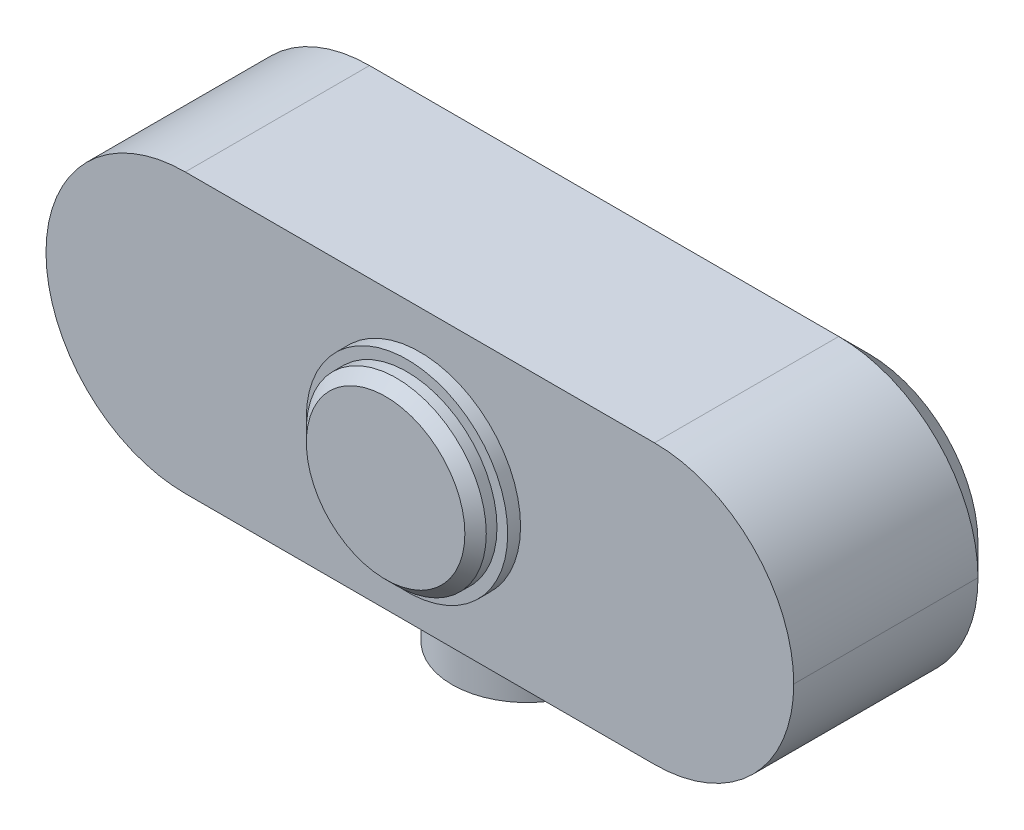
ISO-10303-21;
HEADER;
FILE_DESCRIPTION(('STEP AP214'),'2;1');
FILE_NAME('part.step','',(''),(''),'','','');
FILE_SCHEMA(('AUTOMOTIVE_DESIGN { 1 0 10303 214 1 1 1 1 }'));
ENDSEC;
DATA;
#1=APPLICATION_CONTEXT('core data for automotive mechanical design processes');
#2=APPLICATION_PROTOCOL_DEFINITION('international standard','automotive_design',2000,#1);
#3=PRODUCT_CONTEXT('',#1,'mechanical');
#4=PRODUCT('Part','Part','',(#3));
#5=PRODUCT_RELATED_PRODUCT_CATEGORY('part','',(#4));
#6=PRODUCT_DEFINITION_FORMATION('','',#4);
#7=PRODUCT_DEFINITION_CONTEXT('part definition',#1,'design');
#8=PRODUCT_DEFINITION('design','',#6,#7);
#9=PRODUCT_DEFINITION_SHAPE('','',#8);
#10=(LENGTH_UNIT() NAMED_UNIT(*) SI_UNIT(.MILLI.,.METRE.));
#11=(NAMED_UNIT(*) PLANE_ANGLE_UNIT() SI_UNIT($,.RADIAN.));
#12=(NAMED_UNIT(*) SI_UNIT($,.STERADIAN.) SOLID_ANGLE_UNIT());
#13=UNCERTAINTY_MEASURE_WITH_UNIT(LENGTH_MEASURE(1.E-05),#10,'distance_accuracy_value','');
#14=(GEOMETRIC_REPRESENTATION_CONTEXT(3) GLOBAL_UNCERTAINTY_ASSIGNED_CONTEXT((#13)) GLOBAL_UNIT_ASSIGNED_CONTEXT((#10,
#11,#12)) REPRESENTATION_CONTEXT('',''));
#15=CARTESIAN_POINT('',(0.,0.,0.));
#16=DIRECTION('',(0.,0.,1.));
#17=DIRECTION('',(1.,0.,0.));
#18=AXIS2_PLACEMENT_3D('',#15,#16,#17);
#19=CARTESIAN_POINT('',(34.9,-13.,20.));
#20=DIRECTION('',(0.,1.,0.));
#21=DIRECTION('',(-1.,0.,0.));
#22=AXIS2_PLACEMENT_3D('',#19,#20,#21);
#23=PLANE('',#22);
#24=CARTESIAN_POINT('',(0.,-13.,10.));
#25=DIRECTION('',(0.,1.,0.));
#26=DIRECTION('',(-1.,0.,0.));
#27=AXIS2_PLACEMENT_3D('',#24,#25,#26);
#28=CIRCLE('',#27,7.);
#29=CARTESIAN_POINT('',(-6.99999999999999,-13.,10.));
#30=VERTEX_POINT('',#29);
#31=EDGE_CURVE('E237',#30,#30,#28,.F.);
#32=ORIENTED_EDGE('',*,*,#31,.F.);
#33=EDGE_LOOP('',(#32));
#34=FACE_BOUND('',#33,.T.);
#35=DIRECTION('',(0.,0.,-1.));
#36=VECTOR('',#35,1.);
#37=CARTESIAN_POINT('',(-21.9,-13.,20.));
#38=LINE('',#37,#36);
#39=CARTESIAN_POINT('',(-21.9,-13.,20.));
#40=VERTEX_POINT('',#39);
#41=CARTESIAN_POINT('',(-21.9,-13.,2.79999999999996));
#42=VERTEX_POINT('',#41);
#43=EDGE_CURVE('E213',#40,#42,#38,.T.);
#44=ORIENTED_EDGE('',*,*,#43,.T.);
#45=DIRECTION('',(1.,0.,0.));
#46=VECTOR('',#45,1.);
#47=CARTESIAN_POINT('',(34.9,-13.,2.79999999999996));
#48=LINE('',#47,#46);
#49=CARTESIAN_POINT('',(21.9,-13.,2.79999999999996));
#50=VERTEX_POINT('',#49);
#51=EDGE_CURVE('E260',#42,#50,#48,.T.);
#52=ORIENTED_EDGE('',*,*,#51,.T.);
#53=DIRECTION('',(0.,0.,-1.));
#54=VECTOR('',#53,1.);
#55=CARTESIAN_POINT('',(21.9,-13.,20.));
#56=LINE('',#55,#54);
#57=CARTESIAN_POINT('',(21.9,-13.,20.));
#58=VERTEX_POINT('',#57);
#59=EDGE_CURVE('E211',#50,#58,#56,.F.);
#60=ORIENTED_EDGE('',*,*,#59,.T.);
#61=DIRECTION('',(1.,0.,0.));
#62=VECTOR('',#61,1.);
#63=CARTESIAN_POINT('',(34.9,-13.,20.));
#64=LINE('',#63,#62);
#65=EDGE_CURVE('E204',#40,#58,#64,.T.);
#66=ORIENTED_EDGE('',*,*,#65,.F.);
#67=EDGE_LOOP('',(#44,#52,#60,#66));
#68=FACE_BOUND('',#67,.T.);
#69=ADVANCED_FACE('F40',(#34,#68),#23,.F.);
#70=CARTESIAN_POINT('',(34.9,13.,20.));
#71=DIRECTION('',(0.,-1.,0.));
#72=DIRECTION('',(1.,0.,0.));
#73=AXIS2_PLACEMENT_3D('',#70,#71,#72);
#74=PLANE('',#73);
#75=DIRECTION('',(0.,0.,-1.));
#76=VECTOR('',#75,1.);
#77=CARTESIAN_POINT('',(21.9,13.,20.));
#78=LINE('',#77,#76);
#79=CARTESIAN_POINT('',(21.9,13.,20.));
#80=VERTEX_POINT('',#79);
#81=CARTESIAN_POINT('',(21.9,13.,2.79999999999996));
#82=VERTEX_POINT('',#81);
#83=EDGE_CURVE('E225',#80,#82,#78,.T.);
#84=ORIENTED_EDGE('',*,*,#83,.T.);
#85=DIRECTION('',(-1.,0.,0.));
#86=VECTOR('',#85,1.);
#87=CARTESIAN_POINT('',(34.9,13.,2.79999999999996));
#88=LINE('',#87,#86);
#89=CARTESIAN_POINT('',(-21.9,13.,2.79999999999996));
#90=VERTEX_POINT('',#89);
#91=EDGE_CURVE('E262',#82,#90,#88,.T.);
#92=ORIENTED_EDGE('',*,*,#91,.T.);
#93=DIRECTION('',(0.,0.,-1.));
#94=VECTOR('',#93,1.);
#95=CARTESIAN_POINT('',(-21.9,13.,20.));
#96=LINE('',#95,#94);
#97=CARTESIAN_POINT('',(-21.9,13.,20.));
#98=VERTEX_POINT('',#97);
#99=EDGE_CURVE('E197',#90,#98,#96,.F.);
#100=ORIENTED_EDGE('',*,*,#99,.T.);
#101=DIRECTION('',(-1.,0.,0.));
#102=VECTOR('',#101,1.);
#103=CARTESIAN_POINT('',(34.9,13.,20.));
#104=LINE('',#103,#102);
#105=EDGE_CURVE('E207',#80,#98,#104,.T.);
#106=ORIENTED_EDGE('',*,*,#105,.F.);
#107=EDGE_LOOP('',(#84,#92,#100,#106));
#108=FACE_BOUND('',#107,.T.);
#109=ADVANCED_FACE('F294',(#108),#74,.F.);
#110=CARTESIAN_POINT('',(0.,0.,20.));
#111=DIRECTION('',(0.,0.,1.));
#112=DIRECTION('',(1.,0.,0.));
#113=AXIS2_PLACEMENT_3D('',#110,#111,#112);
#114=PLANE('',#113);
#115=CARTESIAN_POINT('',(0.,0.,20.));
#116=DIRECTION('',(0.,0.,1.));
#117=DIRECTION('',(1.,0.,0.));
#118=AXIS2_PLACEMENT_3D('',#115,#116,#117);
#119=CIRCLE('',#118,9.4);
#120=CARTESIAN_POINT('',(9.4,0.,20.));
#121=VERTEX_POINT('',#120);
#122=EDGE_CURVE('E192',#121,#121,#119,.T.);
#123=ORIENTED_EDGE('',*,*,#122,.F.);
#124=EDGE_LOOP('',(#123));
#125=FACE_BOUND('',#124,.T.);
#126=CARTESIAN_POINT('',(-21.9,0.,20.));
#127=DIRECTION('',(0.,0.,1.));
#128=DIRECTION('',(1.,0.,0.));
#129=AXIS2_PLACEMENT_3D('',#126,#127,#128);
#130=CIRCLE('',#129,13.);
#131=CARTESIAN_POINT('',(-34.9,0.,20.));
#132=VERTEX_POINT('',#131);
#133=EDGE_CURVE('E221',#98,#132,#130,.T.);
#134=ORIENTED_EDGE('',*,*,#133,.T.);
#135=CARTESIAN_POINT('',(-21.9,0.,20.));
#136=DIRECTION('',(0.,0.,1.));
#137=DIRECTION('',(1.,0.,0.));
#138=AXIS2_PLACEMENT_3D('',#135,#136,#137);
#139=CIRCLE('',#138,13.);
#140=EDGE_CURVE('E223',#132,#40,#139,.T.);
#141=ORIENTED_EDGE('',*,*,#140,.T.);
#142=ORIENTED_EDGE('',*,*,#65,.T.);
#143=CARTESIAN_POINT('',(21.9,0.,20.));
#144=DIRECTION('',(0.,0.,1.));
#145=DIRECTION('',(1.,0.,0.));
#146=AXIS2_PLACEMENT_3D('',#143,#144,#145);
#147=CIRCLE('',#146,13.);
#148=CARTESIAN_POINT('',(34.9,0.,20.));
#149=VERTEX_POINT('',#148);
#150=EDGE_CURVE('E218',#58,#149,#147,.T.);
#151=ORIENTED_EDGE('',*,*,#150,.T.);
#152=CARTESIAN_POINT('',(21.9,0.,20.));
#153=DIRECTION('',(0.,0.,1.));
#154=DIRECTION('',(1.,0.,0.));
#155=AXIS2_PLACEMENT_3D('',#152,#153,#154);
#156=CIRCLE('',#155,13.);
#157=EDGE_CURVE('E216',#149,#80,#156,.T.);
#158=ORIENTED_EDGE('',*,*,#157,.T.);
#159=ORIENTED_EDGE('',*,*,#105,.T.);
#160=EDGE_LOOP('',(#134,#141,#142,#151,#158,#159));
#161=FACE_BOUND('',#160,.T.);
#162=ADVANCED_FACE('F298',(#125,#161),#114,.T.);
#163=CARTESIAN_POINT('',(0.,0.,0.));
#164=DIRECTION('',(0.,0.,1.));
#165=DIRECTION('',(1.,0.,0.));
#166=AXIS2_PLACEMENT_3D('',#163,#164,#165);
#167=PLANE('',#166);
#168=DIRECTION('',(-1.,0.,0.));
#169=VECTOR('',#168,1.);
#170=CARTESIAN_POINT('',(0.,-10.2,0.));
#171=LINE('',#170,#169);
#172=CARTESIAN_POINT('',(21.9,-10.2,0.));
#173=VERTEX_POINT('',#172);
#174=CARTESIAN_POINT('',(21.4,-10.2,0.));
#175=VERTEX_POINT('',#174);
#176=EDGE_CURVE('E247',#173,#175,#171,.T.);
#177=ORIENTED_EDGE('',*,*,#176,.T.);
#178=DIRECTION('',(0.,-1.,0.));
#179=VECTOR('',#178,1.);
#180=CARTESIAN_POINT('',(21.4,-10.2,0.));
#181=LINE('',#180,#179);
#182=CARTESIAN_POINT('',(21.4,-8.,0.));
#183=VERTEX_POINT('',#182);
#184=EDGE_CURVE('E58',#183,#175,#181,.T.);
#185=ORIENTED_EDGE('',*,*,#184,.F.);
#186=CARTESIAN_POINT('',(18.9,-8.,0.));
#187=DIRECTION('',(0.,0.,-1.));
#188=DIRECTION('',(1.,0.,0.));
#189=AXIS2_PLACEMENT_3D('',#186,#187,#188);
#190=CIRCLE('',#189,2.5);
#191=CARTESIAN_POINT('',(16.4,-8.,0.));
#192=VERTEX_POINT('',#191);
#193=EDGE_CURVE('E162',#192,#183,#190,.T.);
#194=ORIENTED_EDGE('',*,*,#193,.F.);
#195=DIRECTION('',(0.,1.,0.));
#196=VECTOR('',#195,1.);
#197=CARTESIAN_POINT('',(16.4,-8.,0.));
#198=LINE('',#197,#196);
#199=CARTESIAN_POINT('',(16.4,-10.2,0.));
#200=VERTEX_POINT('',#199);
#201=EDGE_CURVE('E170',#200,#192,#198,.T.);
#202=ORIENTED_EDGE('',*,*,#201,.F.);
#203=CARTESIAN_POINT('',(-21.9,-10.2,0.));
#204=VERTEX_POINT('',#203);
#205=EDGE_CURVE('E246',#200,#204,#171,.T.);
#206=ORIENTED_EDGE('',*,*,#205,.T.);
#207=CARTESIAN_POINT('',(-21.9,0.,0.));
#208=DIRECTION('',(0.,0.,1.));
#209=DIRECTION('',(1.,0.,0.));
#210=AXIS2_PLACEMENT_3D('',#207,#208,#209);
#211=CIRCLE('',#210,10.2);
#212=CARTESIAN_POINT('',(-32.1,0.,0.));
#213=VERTEX_POINT('',#212);
#214=EDGE_CURVE('E252',#204,#213,#211,.F.);
#215=ORIENTED_EDGE('',*,*,#214,.T.);
#216=CARTESIAN_POINT('',(-21.9,0.,0.));
#217=DIRECTION('',(0.,0.,1.));
#218=DIRECTION('',(1.,0.,0.));
#219=AXIS2_PLACEMENT_3D('',#216,#217,#218);
#220=CIRCLE('',#219,10.2);
#221=CARTESIAN_POINT('',(-21.9,10.2,0.));
#222=VERTEX_POINT('',#221);
#223=EDGE_CURVE('E250',#213,#222,#220,.F.);
#224=ORIENTED_EDGE('',*,*,#223,.T.);
#225=DIRECTION('',(1.,0.,0.));
#226=VECTOR('',#225,1.);
#227=CARTESIAN_POINT('',(0.,10.2,0.));
#228=LINE('',#227,#226);
#229=CARTESIAN_POINT('',(21.9,10.2,0.));
#230=VERTEX_POINT('',#229);
#231=EDGE_CURVE('E244',#222,#230,#228,.T.);
#232=ORIENTED_EDGE('',*,*,#231,.T.);
#233=CARTESIAN_POINT('',(21.9,0.,0.));
#234=DIRECTION('',(0.,0.,1.));
#235=DIRECTION('',(1.,0.,0.));
#236=AXIS2_PLACEMENT_3D('',#233,#234,#235);
#237=CIRCLE('',#236,10.2);
#238=CARTESIAN_POINT('',(32.1,0.,0.));
#239=VERTEX_POINT('',#238);
#240=EDGE_CURVE('E240',#230,#239,#237,.F.);
#241=ORIENTED_EDGE('',*,*,#240,.T.);
#242=CARTESIAN_POINT('',(21.9,0.,0.));
#243=DIRECTION('',(0.,0.,1.));
#244=DIRECTION('',(1.,0.,0.));
#245=AXIS2_PLACEMENT_3D('',#242,#243,#244);
#246=CIRCLE('',#245,10.2);
#247=EDGE_CURVE('E242',#239,#173,#246,.F.);
#248=ORIENTED_EDGE('',*,*,#247,.T.);
#249=EDGE_LOOP('',(#177,#185,#194,#202,#206,#215,#224,#232,#241,#248));
#250=FACE_BOUND('',#249,.T.);
#251=ADVANCED_FACE('F375',(#250),#167,.F.);
#252=CARTESIAN_POINT('',(-21.9,0.,20.));
#253=DIRECTION('',(0.,0.,-1.));
#254=DIRECTION('',(-1.,0.,0.));
#255=AXIS2_PLACEMENT_3D('',#252,#253,#254);
#256=CYLINDRICAL_SURFACE('',#255,13.);
#257=ORIENTED_EDGE('',*,*,#99,.F.);
#258=CARTESIAN_POINT('',(-21.9,0.,2.79999999999996));
#259=DIRECTION('',(0.,0.,1.));
#260=DIRECTION('',(1.,0.,0.));
#261=AXIS2_PLACEMENT_3D('',#258,#259,#260);
#262=CIRCLE('',#261,13.);
#263=CARTESIAN_POINT('',(-34.9,0.,2.79999999999996));
#264=VERTEX_POINT('',#263);
#265=EDGE_CURVE('E258',#90,#264,#262,.T.);
#266=ORIENTED_EDGE('',*,*,#265,.T.);
#267=DIRECTION('',(0.,0.,-1.));
#268=VECTOR('',#267,1.);
#269=CARTESIAN_POINT('',(-34.9,0.,20.));
#270=LINE('',#269,#268);
#271=EDGE_CURVE('E208',#132,#264,#270,.T.);
#272=ORIENTED_EDGE('',*,*,#271,.F.);
#273=ORIENTED_EDGE('',*,*,#133,.F.);
#274=EDGE_LOOP('',(#257,#266,#272,#273));
#275=FACE_BOUND('',#274,.T.);
#276=ADVANCED_FACE('F301',(#275),#256,.T.);
#277=CARTESIAN_POINT('',(-21.9,0.,20.));
#278=DIRECTION('',(0.,0.,-1.));
#279=DIRECTION('',(-1.,0.,0.));
#280=AXIS2_PLACEMENT_3D('',#277,#278,#279);
#281=CYLINDRICAL_SURFACE('',#280,13.);
#282=ORIENTED_EDGE('',*,*,#271,.T.);
#283=CARTESIAN_POINT('',(-21.9,0.,2.79999999999996));
#284=DIRECTION('',(0.,0.,1.));
#285=DIRECTION('',(1.,0.,0.));
#286=AXIS2_PLACEMENT_3D('',#283,#284,#285);
#287=CIRCLE('',#286,13.);
#288=EDGE_CURVE('E255',#264,#42,#287,.T.);
#289=ORIENTED_EDGE('',*,*,#288,.T.);
#290=ORIENTED_EDGE('',*,*,#43,.F.);
#291=ORIENTED_EDGE('',*,*,#140,.F.);
#292=EDGE_LOOP('',(#282,#289,#290,#291));
#293=FACE_BOUND('',#292,.T.);
#294=ADVANCED_FACE('F308',(#293),#281,.T.);
#295=CARTESIAN_POINT('',(21.9,0.,20.));
#296=DIRECTION('',(0.,0.,-1.));
#297=DIRECTION('',(-1.,0.,0.));
#298=AXIS2_PLACEMENT_3D('',#295,#296,#297);
#299=CYLINDRICAL_SURFACE('',#298,13.);
#300=DIRECTION('',(0.,0.,-1.));
#301=VECTOR('',#300,1.);
#302=CARTESIAN_POINT('',(34.9,0.,20.));
#303=LINE('',#302,#301);
#304=CARTESIAN_POINT('',(34.9,0.,2.79999999999996));
#305=VERTEX_POINT('',#304);
#306=EDGE_CURVE('E201',#305,#149,#303,.F.);
#307=ORIENTED_EDGE('',*,*,#306,.F.);
#308=CARTESIAN_POINT('',(21.9,0.,2.79999999999996));
#309=DIRECTION('',(0.,0.,1.));
#310=DIRECTION('',(1.,0.,0.));
#311=AXIS2_PLACEMENT_3D('',#308,#309,#310);
#312=CIRCLE('',#311,13.);
#313=EDGE_CURVE('E11',#305,#82,#312,.T.);
#314=ORIENTED_EDGE('',*,*,#313,.T.);
#315=ORIENTED_EDGE('',*,*,#83,.F.);
#316=ORIENTED_EDGE('',*,*,#157,.F.);
#317=EDGE_LOOP('',(#307,#314,#315,#316));
#318=FACE_BOUND('',#317,.T.);
#319=ADVANCED_FACE('F290',(#318),#299,.T.);
#320=CARTESIAN_POINT('',(21.9,0.,20.));
#321=DIRECTION('',(0.,0.,-1.));
#322=DIRECTION('',(-1.,0.,0.));
#323=AXIS2_PLACEMENT_3D('',#320,#321,#322);
#324=CYLINDRICAL_SURFACE('',#323,13.);
#325=ORIENTED_EDGE('',*,*,#59,.F.);
#326=CARTESIAN_POINT('',(21.9,0.,2.79999999999996));
#327=DIRECTION('',(0.,0.,1.));
#328=DIRECTION('',(1.,0.,0.));
#329=AXIS2_PLACEMENT_3D('',#326,#327,#328);
#330=CIRCLE('',#329,13.);
#331=EDGE_CURVE('E50',#50,#305,#330,.T.);
#332=ORIENTED_EDGE('',*,*,#331,.T.);
#333=ORIENTED_EDGE('',*,*,#306,.T.);
#334=ORIENTED_EDGE('',*,*,#150,.F.);
#335=EDGE_LOOP('',(#325,#332,#333,#334));
#336=FACE_BOUND('',#335,.T.);
#337=ADVANCED_FACE('F313',(#336),#324,.T.);
#338=CARTESIAN_POINT('',(0.,0.,21.2));
#339=DIRECTION('',(0.,0.,-1.));
#340=DIRECTION('',(-1.,0.,0.));
#341=AXIS2_PLACEMENT_3D('',#338,#339,#340);
#342=CYLINDRICAL_SURFACE('',#341,9.4);
#343=CARTESIAN_POINT('',(0.,0.,21.2));
#344=DIRECTION('',(0.,0.,1.));
#345=DIRECTION('',(1.,0.,0.));
#346=AXIS2_PLACEMENT_3D('',#343,#344,#345);
#347=CIRCLE('',#346,9.4);
#348=CARTESIAN_POINT('',(9.4,0.,21.2));
#349=VERTEX_POINT('',#348);
#350=EDGE_CURVE('E198',#349,#349,#347,.T.);
#351=ORIENTED_EDGE('',*,*,#350,.F.);
#352=EDGE_LOOP('',(#351));
#353=FACE_BOUND('',#352,.T.);
#354=ORIENTED_EDGE('',*,*,#122,.T.);
#355=EDGE_LOOP('',(#354));
#356=FACE_BOUND('',#355,.T.);
#357=ADVANCED_FACE('F315',(#353,#356),#342,.T.);
#358=CARTESIAN_POINT('',(0.,0.,21.2));
#359=DIRECTION('',(0.,0.,1.));
#360=DIRECTION('',(1.,0.,0.));
#361=AXIS2_PLACEMENT_3D('',#358,#359,#360);
#362=PLANE('',#361);
#363=CARTESIAN_POINT('',(0.,0.,21.2));
#364=DIRECTION('',(0.,0.,1.));
#365=DIRECTION('',(1.,0.,0.));
#366=AXIS2_PLACEMENT_3D('',#363,#364,#365);
#367=CIRCLE('',#366,8.4);
#368=CARTESIAN_POINT('',(8.4,0.,21.2));
#369=VERTEX_POINT('',#368);
#370=EDGE_CURVE('E193',#369,#369,#367,.T.);
#371=ORIENTED_EDGE('',*,*,#370,.F.);
#372=EDGE_LOOP('',(#371));
#373=FACE_BOUND('',#372,.T.);
#374=ORIENTED_EDGE('',*,*,#350,.T.);
#375=EDGE_LOOP('',(#374));
#376=FACE_BOUND('',#375,.T.);
#377=ADVANCED_FACE('F321',(#373,#376),#362,.T.);
#378=CARTESIAN_POINT('',(0.,0.,23.2));
#379=DIRECTION('',(0.,0.,-1.));
#380=DIRECTION('',(-1.,0.,0.));
#381=AXIS2_PLACEMENT_3D('',#378,#379,#380);
#382=CYLINDRICAL_SURFACE('',#381,8.4);
#383=CARTESIAN_POINT('',(0.,0.,22.2));
#384=DIRECTION('',(0.,0.,1.));
#385=DIRECTION('',(1.,0.,0.));
#386=AXIS2_PLACEMENT_3D('',#383,#384,#385);
#387=CIRCLE('',#386,8.4);
#388=CARTESIAN_POINT('',(8.4,0.,22.2));
#389=VERTEX_POINT('',#388);
#390=EDGE_CURVE('E234',#389,#389,#387,.F.);
#391=ORIENTED_EDGE('',*,*,#390,.T.);
#392=EDGE_LOOP('',(#391));
#393=FACE_BOUND('',#392,.T.);
#394=ORIENTED_EDGE('',*,*,#370,.T.);
#395=EDGE_LOOP('',(#394));
#396=FACE_BOUND('',#395,.T.);
#397=ADVANCED_FACE('F365',(#393,#396),#382,.T.);
#398=CARTESIAN_POINT('',(0.,0.,23.2));
#399=DIRECTION('',(0.,0.,1.));
#400=DIRECTION('',(1.,0.,0.));
#401=AXIS2_PLACEMENT_3D('',#398,#399,#400);
#402=PLANE('',#401);
#403=CARTESIAN_POINT('',(0.,0.,23.2));
#404=DIRECTION('',(0.,0.,1.));
#405=DIRECTION('',(1.,0.,0.));
#406=AXIS2_PLACEMENT_3D('',#403,#404,#405);
#407=CIRCLE('',#406,7.4);
#408=CARTESIAN_POINT('',(7.4,0.,23.2));
#409=VERTEX_POINT('',#408);
#410=EDGE_CURVE('E196',#409,#409,#407,.T.);
#411=ORIENTED_EDGE('',*,*,#410,.T.);
#412=EDGE_LOOP('',(#411));
#413=FACE_BOUND('',#412,.T.);
#414=ADVANCED_FACE('F362',(#413),#402,.T.);
#415=CARTESIAN_POINT('',(0.,0.,23.2));
#416=DIRECTION('',(0.,0.,-1.));
#417=DIRECTION('',(-1.,0.,0.));
#418=AXIS2_PLACEMENT_3D('',#415,#416,#417);
#419=CONICAL_SURFACE('',#418,7.4,0.785398163397447);
#420=ORIENTED_EDGE('',*,*,#390,.F.);
#421=EDGE_LOOP('',(#420));
#422=FACE_BOUND('',#421,.T.);
#423=ORIENTED_EDGE('',*,*,#410,.F.);
#424=EDGE_LOOP('',(#423));
#425=FACE_BOUND('',#424,.T.);
#426=ADVANCED_FACE('F359',(#422,#425),#419,.T.);
#427=CARTESIAN_POINT('',(0.,-19.,10.));
#428=DIRECTION('',(0.,-1.,0.));
#429=DIRECTION('',(1.,0.,0.));
#430=AXIS2_PLACEMENT_3D('',#427,#428,#429);
#431=PLANE('',#430);
#432=CARTESIAN_POINT('',(0.,-19.,10.));
#433=DIRECTION('',(0.,-1.,0.));
#434=DIRECTION('',(1.,0.,0.));
#435=AXIS2_PLACEMENT_3D('',#432,#433,#434);
#436=CIRCLE('',#435,7.);
#437=CARTESIAN_POINT('',(7.00000000000001,-19.,10.));
#438=VERTEX_POINT('',#437);
#439=EDGE_CURVE('E187',#438,#438,#436,.T.);
#440=ORIENTED_EDGE('',*,*,#439,.T.);
#441=EDGE_LOOP('',(#440));
#442=FACE_BOUND('',#441,.T.);
#443=CARTESIAN_POINT('',(0.,-19.,10.));
#444=DIRECTION('',(0.,-1.,0.));
#445=DIRECTION('',(1.,0.,0.));
#446=AXIS2_PLACEMENT_3D('',#443,#444,#445);
#447=CIRCLE('',#446,5.);
#448=CARTESIAN_POINT('',(5.00000000000001,-19.,10.));
#449=VERTEX_POINT('',#448);
#450=EDGE_CURVE('E184',#449,#449,#447,.T.);
#451=ORIENTED_EDGE('',*,*,#450,.F.);
#452=EDGE_LOOP('',(#451));
#453=FACE_BOUND('',#452,.T.);
#454=ADVANCED_FACE('F351',(#442,#453),#431,.T.);
#455=CARTESIAN_POINT('',(0.,-19.,10.));
#456=DIRECTION('',(0.,1.,0.));
#457=DIRECTION('',(-1.,0.,0.));
#458=AXIS2_PLACEMENT_3D('',#455,#456,#457);
#459=CYLINDRICAL_SURFACE('',#458,7.);
#460=ORIENTED_EDGE('',*,*,#439,.F.);
#461=EDGE_LOOP('',(#460));
#462=FACE_BOUND('',#461,.T.);
#463=ORIENTED_EDGE('',*,*,#31,.T.);
#464=EDGE_LOOP('',(#463));
#465=FACE_BOUND('',#464,.T.);
#466=ADVANCED_FACE('F343',(#462,#465),#459,.T.);
#467=CARTESIAN_POINT('',(0.,-19.,10.));
#468=DIRECTION('',(0.,1.,0.));
#469=DIRECTION('',(-1.,0.,0.));
#470=AXIS2_PLACEMENT_3D('',#467,#468,#469);
#471=CYLINDRICAL_SURFACE('',#470,5.);
#472=ORIENTED_EDGE('',*,*,#450,.T.);
#473=EDGE_LOOP('',(#472));
#474=FACE_BOUND('',#473,.T.);
#475=CARTESIAN_POINT('',(0.,-13.,10.));
#476=DIRECTION('',(0.,-1.,0.));
#477=DIRECTION('',(1.,0.,0.));
#478=AXIS2_PLACEMENT_3D('',#475,#476,#477);
#479=CIRCLE('',#478,5.);
#480=CARTESIAN_POINT('',(5.00000000000001,-13.,10.));
#481=VERTEX_POINT('',#480);
#482=EDGE_CURVE('E183',#481,#481,#479,.T.);
#483=ORIENTED_EDGE('',*,*,#482,.F.);
#484=EDGE_LOOP('',(#483));
#485=FACE_BOUND('',#484,.T.);
#486=ADVANCED_FACE('F337',(#474,#485),#471,.F.);
#487=ORIENTED_EDGE('',*,*,#482,.T.);
#488=EDGE_LOOP('',(#487));
#489=FACE_BOUND('',#488,.T.);
#490=ADVANCED_FACE('F329',(#489),#23,.F.);
#491=CARTESIAN_POINT('',(21.9,0.,0.));
#492=DIRECTION('',(0.,0.,1.));
#493=DIRECTION('',(1.,0.,0.));
#494=AXIS2_PLACEMENT_3D('',#491,#492,#493);
#495=CONICAL_SURFACE('',#494,10.2,0.785398163397449);
#496=DIRECTION('',(0.,-0.707106781186548,-0.707106781186547));
#497=VECTOR('',#496,1.);
#498=CARTESIAN_POINT('',(21.9,13.,2.79999999999996));
#499=LINE('',#498,#497);
#500=EDGE_CURVE('E273',#82,#230,#499,.T.);
#501=ORIENTED_EDGE('',*,*,#500,.F.);
#502=ORIENTED_EDGE('',*,*,#313,.F.);
#503=DIRECTION('',(0.707106781186548,0.,0.707106781186548));
#504=VECTOR('',#503,1.);
#505=CARTESIAN_POINT('',(32.1,0.,0.));
#506=LINE('',#505,#504);
#507=EDGE_CURVE('E45',#239,#305,#506,.T.);
#508=ORIENTED_EDGE('',*,*,#507,.F.);
#509=ORIENTED_EDGE('',*,*,#240,.F.);
#510=EDGE_LOOP('',(#501,#502,#508,#509));
#511=FACE_BOUND('',#510,.T.);
#512=ADVANCED_FACE('F43',(#511),#495,.T.);
#513=CARTESIAN_POINT('',(21.9,0.,0.));
#514=DIRECTION('',(0.,0.,1.));
#515=DIRECTION('',(1.,0.,0.));
#516=AXIS2_PLACEMENT_3D('',#513,#514,#515);
#517=CONICAL_SURFACE('',#516,10.2,0.785398163397449);
#518=ORIENTED_EDGE('',*,*,#507,.T.);
#519=ORIENTED_EDGE('',*,*,#331,.F.);
#520=DIRECTION('',(0.,-0.707106781186548,0.707106781186547));
#521=VECTOR('',#520,1.);
#522=CARTESIAN_POINT('',(21.9,-10.2,0.));
#523=LINE('',#522,#521);
#524=EDGE_CURVE('E271',#173,#50,#523,.T.);
#525=ORIENTED_EDGE('',*,*,#524,.F.);
#526=ORIENTED_EDGE('',*,*,#247,.F.);
#527=EDGE_LOOP('',(#518,#519,#525,#526));
#528=FACE_BOUND('',#527,.T.);
#529=ADVANCED_FACE('F283',(#528),#517,.T.);
#530=CARTESIAN_POINT('',(34.9,13.,2.79999999999996));
#531=DIRECTION('',(0.,-0.707106781186547,0.707106781186548));
#532=DIRECTION('',(-1.,0.,0.));
#533=AXIS2_PLACEMENT_3D('',#530,#531,#532);
#534=PLANE('',#533);
#535=ORIENTED_EDGE('',*,*,#500,.T.);
#536=ORIENTED_EDGE('',*,*,#231,.F.);
#537=DIRECTION('',(0.,-0.707106781186548,-0.707106781186547));
#538=VECTOR('',#537,1.);
#539=CARTESIAN_POINT('',(-21.9,13.,2.79999999999996));
#540=LINE('',#539,#538);
#541=EDGE_CURVE('E268',#90,#222,#540,.T.);
#542=ORIENTED_EDGE('',*,*,#541,.F.);
#543=ORIENTED_EDGE('',*,*,#91,.F.);
#544=EDGE_LOOP('',(#535,#536,#542,#543));
#545=FACE_BOUND('',#544,.T.);
#546=ADVANCED_FACE('F453',(#545),#534,.F.);
#547=CARTESIAN_POINT('',(34.9,-13.,2.79999999999996));
#548=DIRECTION('',(0.,0.707106781186548,0.707106781186548));
#549=DIRECTION('',(1.,0.,0.));
#550=AXIS2_PLACEMENT_3D('',#547,#548,#549);
#551=PLANE('',#550);
#552=ORIENTED_EDGE('',*,*,#524,.T.);
#553=ORIENTED_EDGE('',*,*,#51,.F.);
#554=DIRECTION('',(0.,-0.707106781186548,0.707106781186548));
#555=VECTOR('',#554,1.);
#556=CARTESIAN_POINT('',(-21.9,-10.2,0.));
#557=LINE('',#556,#555);
#558=EDGE_CURVE('E266',#204,#42,#557,.T.);
#559=ORIENTED_EDGE('',*,*,#558,.F.);
#560=ORIENTED_EDGE('',*,*,#205,.F.);
#561=DIRECTION('',(-1.,0.,0.));
#562=VECTOR('',#561,1.);
#563=CARTESIAN_POINT('',(21.4,-10.2,0.));
#564=LINE('',#563,#562);
#565=EDGE_CURVE('E144',#175,#200,#564,.T.);
#566=ORIENTED_EDGE('',*,*,#565,.F.);
#567=ORIENTED_EDGE('',*,*,#176,.F.);
#568=EDGE_LOOP('',(#552,#553,#559,#560,#566,#567));
#569=FACE_BOUND('',#568,.T.);
#570=ADVANCED_FACE('F385',(#569),#551,.F.);
#571=CARTESIAN_POINT('',(-21.9,0.,0.));
#572=DIRECTION('',(0.,0.,1.));
#573=DIRECTION('',(1.,0.,0.));
#574=AXIS2_PLACEMENT_3D('',#571,#572,#573);
#575=CONICAL_SURFACE('',#574,10.2,0.785398163397449);
#576=ORIENTED_EDGE('',*,*,#541,.T.);
#577=ORIENTED_EDGE('',*,*,#223,.F.);
#578=DIRECTION('',(0.707106781186548,0.,-0.707106781186548));
#579=VECTOR('',#578,1.);
#580=CARTESIAN_POINT('',(-34.9,0.,2.79999999999996));
#581=LINE('',#580,#579);
#582=EDGE_CURVE('E176',#264,#213,#581,.T.);
#583=ORIENTED_EDGE('',*,*,#582,.F.);
#584=ORIENTED_EDGE('',*,*,#265,.F.);
#585=EDGE_LOOP('',(#576,#577,#583,#584));
#586=FACE_BOUND('',#585,.T.);
#587=ADVANCED_FACE('F452',(#586),#575,.T.);
#588=CARTESIAN_POINT('',(-21.9,0.,0.));
#589=DIRECTION('',(0.,0.,1.));
#590=DIRECTION('',(1.,0.,0.));
#591=AXIS2_PLACEMENT_3D('',#588,#589,#590);
#592=CONICAL_SURFACE('',#591,10.2,0.785398163397449);
#593=ORIENTED_EDGE('',*,*,#558,.T.);
#594=ORIENTED_EDGE('',*,*,#288,.F.);
#595=ORIENTED_EDGE('',*,*,#582,.T.);
#596=ORIENTED_EDGE('',*,*,#214,.F.);
#597=EDGE_LOOP('',(#593,#594,#595,#596));
#598=FACE_BOUND('',#597,.T.);
#599=ADVANCED_FACE('F399',(#598),#592,.T.);
#600=CARTESIAN_POINT('',(21.4,-10.2,1.));
#601=DIRECTION('',(0.,-1.,0.));
#602=DIRECTION('',(0.,0.,-1.));
#603=AXIS2_PLACEMENT_3D('',#600,#601,#602);
#604=PLANE('',#603);
#605=ORIENTED_EDGE('',*,*,#565,.T.);
#606=DIRECTION('',(0.,0.,-1.));
#607=VECTOR('',#606,1.);
#608=CARTESIAN_POINT('',(16.4,-10.2,1.));
#609=LINE('',#608,#607);
#610=CARTESIAN_POINT('',(16.4,-10.2,1.));
#611=VERTEX_POINT('',#610);
#612=EDGE_CURVE('E137',#611,#200,#609,.T.);
#613=ORIENTED_EDGE('',*,*,#612,.F.);
#614=DIRECTION('',(-1.,0.,0.));
#615=VECTOR('',#614,1.);
#616=CARTESIAN_POINT('',(21.4,-10.2,1.));
#617=LINE('',#616,#615);
#618=CARTESIAN_POINT('',(21.4,-10.2,1.));
#619=VERTEX_POINT('',#618);
#620=EDGE_CURVE('E141',#619,#611,#617,.T.);
#621=ORIENTED_EDGE('',*,*,#620,.F.);
#622=DIRECTION('',(0.,0.,-1.));
#623=VECTOR('',#622,1.);
#624=CARTESIAN_POINT('',(21.4,-10.2,1.));
#625=LINE('',#624,#623);
#626=EDGE_CURVE('E174',#619,#175,#625,.T.);
#627=ORIENTED_EDGE('',*,*,#626,.T.);
#628=EDGE_LOOP('',(#605,#613,#621,#627));
#629=FACE_BOUND('',#628,.T.);
#630=ADVANCED_FACE('F139',(#629),#604,.F.);
#631=CARTESIAN_POINT('',(21.4,-10.2,1.));
#632=DIRECTION('',(1.,0.,0.));
#633=DIRECTION('',(0.,0.,-1.));
#634=AXIS2_PLACEMENT_3D('',#631,#632,#633);
#635=PLANE('',#634);
#636=ORIENTED_EDGE('',*,*,#184,.T.);
#637=ORIENTED_EDGE('',*,*,#626,.F.);
#638=DIRECTION('',(0.,-1.,0.));
#639=VECTOR('',#638,1.);
#640=CARTESIAN_POINT('',(21.4,-10.2,1.));
#641=LINE('',#640,#639);
#642=CARTESIAN_POINT('',(21.4,-8.,1.));
#643=VERTEX_POINT('',#642);
#644=EDGE_CURVE('E149',#643,#619,#641,.T.);
#645=ORIENTED_EDGE('',*,*,#644,.F.);
#646=DIRECTION('',(0.,0.,-1.));
#647=VECTOR('',#646,1.);
#648=CARTESIAN_POINT('',(21.4,-8.,1.));
#649=LINE('',#648,#647);
#650=EDGE_CURVE('E177',#643,#183,#649,.T.);
#651=ORIENTED_EDGE('',*,*,#650,.T.);
#652=EDGE_LOOP('',(#636,#637,#645,#651));
#653=FACE_BOUND('',#652,.T.);
#654=ADVANCED_FACE('F391',(#653),#635,.F.);
#655=CARTESIAN_POINT('',(18.9,-8.,1.));
#656=DIRECTION('',(0.,0.,-1.));
#657=DIRECTION('',(-1.,0.,0.));
#658=AXIS2_PLACEMENT_3D('',#655,#656,#657);
#659=CYLINDRICAL_SURFACE('',#658,2.5);
#660=ORIENTED_EDGE('',*,*,#193,.T.);
#661=ORIENTED_EDGE('',*,*,#650,.F.);
#662=CARTESIAN_POINT('',(18.9,-8.,1.));
#663=DIRECTION('',(0.,0.,-1.));
#664=DIRECTION('',(1.,0.,0.));
#665=AXIS2_PLACEMENT_3D('',#662,#663,#664);
#666=CIRCLE('',#665,2.5);
#667=CARTESIAN_POINT('',(16.4,-8.,1.));
#668=VERTEX_POINT('',#667);
#669=EDGE_CURVE('E157',#668,#643,#666,.T.);
#670=ORIENTED_EDGE('',*,*,#669,.F.);
#671=DIRECTION('',(0.,0.,-1.));
#672=VECTOR('',#671,1.);
#673=CARTESIAN_POINT('',(16.4,-8.,1.));
#674=LINE('',#673,#672);
#675=EDGE_CURVE('E148',#668,#192,#674,.T.);
#676=ORIENTED_EDGE('',*,*,#675,.T.);
#677=EDGE_LOOP('',(#660,#661,#670,#676));
#678=FACE_BOUND('',#677,.T.);
#679=ADVANCED_FACE('F390',(#678),#659,.F.);
#680=CARTESIAN_POINT('',(16.4,-8.,1.));
#681=DIRECTION('',(-1.,0.,0.));
#682=DIRECTION('',(0.,0.,1.));
#683=AXIS2_PLACEMENT_3D('',#680,#681,#682);
#684=PLANE('',#683);
#685=ORIENTED_EDGE('',*,*,#201,.T.);
#686=ORIENTED_EDGE('',*,*,#675,.F.);
#687=DIRECTION('',(0.,1.,0.));
#688=VECTOR('',#687,1.);
#689=CARTESIAN_POINT('',(16.4,-8.,1.));
#690=LINE('',#689,#688);
#691=EDGE_CURVE('E152',#611,#668,#690,.T.);
#692=ORIENTED_EDGE('',*,*,#691,.F.);
#693=ORIENTED_EDGE('',*,*,#612,.T.);
#694=EDGE_LOOP('',(#685,#686,#692,#693));
#695=FACE_BOUND('',#694,.T.);
#696=ADVANCED_FACE('F153',(#695),#684,.F.);
#697=CARTESIAN_POINT('',(18.9,-8.,1.));
#698=DIRECTION('',(0.,0.,1.));
#699=DIRECTION('',(1.,0.,0.));
#700=AXIS2_PLACEMENT_3D('',#697,#698,#699);
#701=PLANE('',#700);
#702=CARTESIAN_POINT('',(18.9,-8.,1.));
#703=DIRECTION('',(0.,0.,-1.));
#704=DIRECTION('',(-1.,0.,0.));
#705=AXIS2_PLACEMENT_3D('',#702,#703,#704);
#706=CIRCLE('',#705,1.75);
#707=CARTESIAN_POINT('',(17.15,-8.,1.));
#708=VERTEX_POINT('',#707);
#709=EDGE_CURVE('E165',#708,#708,#706,.T.);
#710=ORIENTED_EDGE('',*,*,#709,.F.);
#711=EDGE_LOOP('',(#710));
#712=FACE_BOUND('',#711,.T.);
#713=ORIENTED_EDGE('',*,*,#620,.T.);
#714=ORIENTED_EDGE('',*,*,#691,.T.);
#715=ORIENTED_EDGE('',*,*,#669,.T.);
#716=ORIENTED_EDGE('',*,*,#644,.T.);
#717=EDGE_LOOP('',(#713,#714,#715,#716));
#718=FACE_BOUND('',#717,.T.);
#719=ADVANCED_FACE('F159',(#712,#718),#701,.F.);
#720=CARTESIAN_POINT('',(18.9,-8.,-5.));
#721=DIRECTION('',(0.,0.,-1.));
#722=DIRECTION('',(-1.,0.,0.));
#723=AXIS2_PLACEMENT_3D('',#720,#721,#722);
#724=PLANE('',#723);
#725=CARTESIAN_POINT('',(18.9,-8.,-5.));
#726=DIRECTION('',(0.,0.,-1.));
#727=DIRECTION('',(-1.,0.,0.));
#728=AXIS2_PLACEMENT_3D('',#725,#726,#727);
#729=CIRCLE('',#728,1.75);
#730=CARTESIAN_POINT('',(17.15,-8.,-5.));
#731=VERTEX_POINT('',#730);
#732=EDGE_CURVE('E180',#731,#731,#729,.T.);
#733=ORIENTED_EDGE('',*,*,#732,.T.);
#734=EDGE_LOOP('',(#733));
#735=FACE_BOUND('',#734,.T.);
#736=ADVANCED_FACE('F404',(#735),#724,.T.);
#737=CARTESIAN_POINT('',(18.9,-8.,-5.));
#738=DIRECTION('',(0.,0.,1.));
#739=DIRECTION('',(1.,0.,0.));
#740=AXIS2_PLACEMENT_3D('',#737,#738,#739);
#741=CYLINDRICAL_SURFACE('',#740,1.75);
#742=ORIENTED_EDGE('',*,*,#732,.F.);
#743=EDGE_LOOP('',(#742));
#744=FACE_BOUND('',#743,.T.);
#745=ORIENTED_EDGE('',*,*,#709,.T.);
#746=EDGE_LOOP('',(#745));
#747=FACE_BOUND('',#746,.T.);
#748=ADVANCED_FACE('F356',(#744,#747),#741,.T.);
#749=CLOSED_SHELL('',(#69,#109,#162,#251,#276,#294,#319,#337,#357,#377,#397,#414,#426,#454,#466,
#486,#490,#512,#529,#546,#570,#587,#599,#630,#654,#679,#696,#719,#736,#748));
#750=MANIFOLD_SOLID_BREP('B2',#749);
#751=ADVANCED_BREP_SHAPE_REPRESENTATION('',(#18,#750),#14);
#752=SHAPE_DEFINITION_REPRESENTATION(#9,#751);
ENDSEC;
END-ISO-10303-21;
